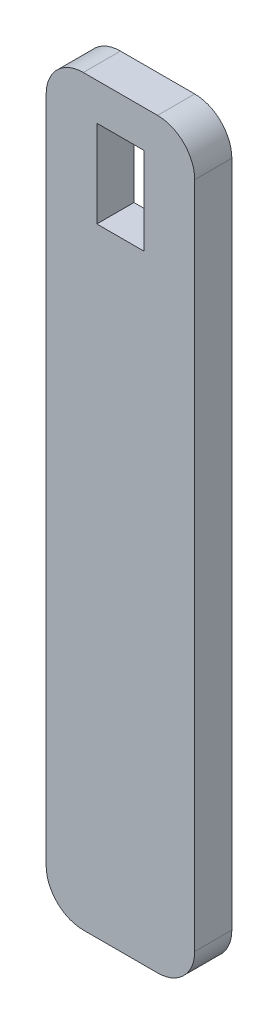
ISO-10303-21;
HEADER;
FILE_DESCRIPTION(('STEP AP214'),'2;1');
FILE_NAME('part.step','',(''),(''),'','','');
FILE_SCHEMA(('AUTOMOTIVE_DESIGN { 1 0 10303 214 1 1 1 1 }'));
ENDSEC;
DATA;
#1=APPLICATION_CONTEXT('core data for automotive mechanical design processes');
#2=APPLICATION_PROTOCOL_DEFINITION('international standard','automotive_design',2000,#1);
#3=PRODUCT_CONTEXT('',#1,'mechanical');
#4=PRODUCT('Part','Part','',(#3));
#5=PRODUCT_RELATED_PRODUCT_CATEGORY('part','',(#4));
#6=PRODUCT_DEFINITION_FORMATION('','',#4);
#7=PRODUCT_DEFINITION_CONTEXT('part definition',#1,'design');
#8=PRODUCT_DEFINITION('design','',#6,#7);
#9=PRODUCT_DEFINITION_SHAPE('','',#8);
#10=(LENGTH_UNIT() NAMED_UNIT(*) SI_UNIT(.MILLI.,.METRE.));
#11=(NAMED_UNIT(*) PLANE_ANGLE_UNIT() SI_UNIT($,.RADIAN.));
#12=(NAMED_UNIT(*) SI_UNIT($,.STERADIAN.) SOLID_ANGLE_UNIT());
#13=UNCERTAINTY_MEASURE_WITH_UNIT(LENGTH_MEASURE(1.E-05),#10,'distance_accuracy_value','');
#14=(GEOMETRIC_REPRESENTATION_CONTEXT(3) GLOBAL_UNCERTAINTY_ASSIGNED_CONTEXT((#13)) GLOBAL_UNIT_ASSIGNED_CONTEXT((#10,
#11,#12)) REPRESENTATION_CONTEXT('',''));
#15=CARTESIAN_POINT('',(0.,0.,0.));
#16=DIRECTION('',(0.,0.,1.));
#17=DIRECTION('',(1.,0.,0.));
#18=AXIS2_PLACEMENT_3D('',#15,#16,#17);
#19=CARTESIAN_POINT('',(0.,0.,10.));
#20=DIRECTION('',(1.,0.,0.));
#21=DIRECTION('',(0.,0.,-1.));
#22=AXIS2_PLACEMENT_3D('',#19,#20,#21);
#23=PLANE('',#22);
#24=DIRECTION('',(0.,-1.,0.));
#25=VECTOR('',#24,1.);
#26=CARTESIAN_POINT('',(0.,0.,0.));
#27=LINE('',#26,#25);
#28=CARTESIAN_POINT('',(0.,190.,0.));
#29=VERTEX_POINT('',#28);
#30=CARTESIAN_POINT('',(0.,10.,0.));
#31=VERTEX_POINT('',#30);
#32=EDGE_CURVE('E156',#29,#31,#27,.T.);
#33=ORIENTED_EDGE('',*,*,#32,.T.);
#34=DIRECTION('',(0.,0.,-1.));
#35=VECTOR('',#34,1.);
#36=CARTESIAN_POINT('',(0.,10.,10.));
#37=LINE('',#36,#35);
#38=CARTESIAN_POINT('',(0.,10.,10.));
#39=VERTEX_POINT('',#38);
#40=EDGE_CURVE('E212',#31,#39,#37,.F.);
#41=ORIENTED_EDGE('',*,*,#40,.T.);
#42=DIRECTION('',(0.,-1.,0.));
#43=VECTOR('',#42,1.);
#44=CARTESIAN_POINT('',(0.,0.,10.));
#45=LINE('',#44,#43);
#46=CARTESIAN_POINT('',(0.,190.,10.));
#47=VERTEX_POINT('',#46);
#48=EDGE_CURVE('E160',#47,#39,#45,.T.);
#49=ORIENTED_EDGE('',*,*,#48,.F.);
#50=DIRECTION('',(0.,0.,-1.));
#51=VECTOR('',#50,1.);
#52=CARTESIAN_POINT('',(0.,190.,10.));
#53=LINE('',#52,#51);
#54=EDGE_CURVE('E209',#47,#29,#53,.T.);
#55=ORIENTED_EDGE('',*,*,#54,.T.);
#56=EDGE_LOOP('',(#33,#41,#49,#55));
#57=FACE_BOUND('',#56,.T.);
#58=ADVANCED_FACE('F34',(#57),#23,.F.);
#59=CARTESIAN_POINT('',(0.,0.,10.));
#60=DIRECTION('',(0.,1.,0.));
#61=DIRECTION('',(0.,0.,1.));
#62=AXIS2_PLACEMENT_3D('',#59,#60,#61);
#63=PLANE('',#62);
#64=DIRECTION('',(1.,0.,0.));
#65=VECTOR('',#64,1.);
#66=CARTESIAN_POINT('',(0.,0.,0.));
#67=LINE('',#66,#65);
#68=CARTESIAN_POINT('',(10.,0.,0.));
#69=VERTEX_POINT('',#68);
#70=CARTESIAN_POINT('',(30.,0.,0.));
#71=VERTEX_POINT('',#70);
#72=EDGE_CURVE('E176',#69,#71,#67,.T.);
#73=ORIENTED_EDGE('',*,*,#72,.T.);
#74=DIRECTION('',(0.,0.,-1.));
#75=VECTOR('',#74,1.);
#76=CARTESIAN_POINT('',(30.,0.,10.));
#77=LINE('',#76,#75);
#78=CARTESIAN_POINT('',(30.,0.,10.));
#79=VERTEX_POINT('',#78);
#80=EDGE_CURVE('E199',#71,#79,#77,.F.);
#81=ORIENTED_EDGE('',*,*,#80,.T.);
#82=DIRECTION('',(1.,0.,0.));
#83=VECTOR('',#82,1.);
#84=CARTESIAN_POINT('',(0.,0.,10.));
#85=LINE('',#84,#83);
#86=CARTESIAN_POINT('',(10.,0.,10.));
#87=VERTEX_POINT('',#86);
#88=EDGE_CURVE('E163',#87,#79,#85,.T.);
#89=ORIENTED_EDGE('',*,*,#88,.F.);
#90=DIRECTION('',(0.,0.,-1.));
#91=VECTOR('',#90,1.);
#92=CARTESIAN_POINT('',(10.,0.,10.));
#93=LINE('',#92,#91);
#94=EDGE_CURVE('E196',#87,#69,#93,.T.);
#95=ORIENTED_EDGE('',*,*,#94,.T.);
#96=EDGE_LOOP('',(#73,#81,#89,#95));
#97=FACE_BOUND('',#96,.T.);
#98=ADVANCED_FACE('F237',(#97),#63,.F.);
#99=CARTESIAN_POINT('',(40.,0.,10.));
#100=DIRECTION('',(-1.,0.,0.));
#101=DIRECTION('',(0.,0.,1.));
#102=AXIS2_PLACEMENT_3D('',#99,#100,#101);
#103=PLANE('',#102);
#104=DIRECTION('',(0.,1.,0.));
#105=VECTOR('',#104,1.);
#106=CARTESIAN_POINT('',(40.,0.,10.));
#107=LINE('',#106,#105);
#108=CARTESIAN_POINT('',(40.,10.,10.));
#109=VERTEX_POINT('',#108);
#110=CARTESIAN_POINT('',(40.,190.,10.));
#111=VERTEX_POINT('',#110);
#112=EDGE_CURVE('E167',#109,#111,#107,.T.);
#113=ORIENTED_EDGE('',*,*,#112,.F.);
#114=DIRECTION('',(0.,0.,-1.));
#115=VECTOR('',#114,1.);
#116=CARTESIAN_POINT('',(40.,10.,10.));
#117=LINE('',#116,#115);
#118=CARTESIAN_POINT('',(40.,10.,0.));
#119=VERTEX_POINT('',#118);
#120=EDGE_CURVE('E185',#109,#119,#117,.T.);
#121=ORIENTED_EDGE('',*,*,#120,.T.);
#122=DIRECTION('',(0.,1.,0.));
#123=VECTOR('',#122,1.);
#124=CARTESIAN_POINT('',(40.,0.,0.));
#125=LINE('',#124,#123);
#126=CARTESIAN_POINT('',(40.,190.,0.));
#127=VERTEX_POINT('',#126);
#128=EDGE_CURVE('E179',#119,#127,#125,.T.);
#129=ORIENTED_EDGE('',*,*,#128,.T.);
#130=DIRECTION('',(0.,0.,-1.));
#131=VECTOR('',#130,1.);
#132=CARTESIAN_POINT('',(40.,190.,10.));
#133=LINE('',#132,#131);
#134=EDGE_CURVE('E173',#127,#111,#133,.F.);
#135=ORIENTED_EDGE('',*,*,#134,.T.);
#136=EDGE_LOOP('',(#113,#121,#129,#135));
#137=FACE_BOUND('',#136,.T.);
#138=ADVANCED_FACE('F245',(#137),#103,.F.);
#139=CARTESIAN_POINT('',(0.,200.,10.));
#140=DIRECTION('',(0.,-1.,0.));
#141=DIRECTION('',(0.,0.,-1.));
#142=AXIS2_PLACEMENT_3D('',#139,#140,#141);
#143=PLANE('',#142);
#144=DIRECTION('',(-1.,0.,0.));
#145=VECTOR('',#144,1.);
#146=CARTESIAN_POINT('',(0.,200.,10.));
#147=LINE('',#146,#145);
#148=CARTESIAN_POINT('',(30.,200.,10.));
#149=VERTEX_POINT('',#148);
#150=CARTESIAN_POINT('',(10.,200.,10.));
#151=VERTEX_POINT('',#150);
#152=EDGE_CURVE('E170',#149,#151,#147,.T.);
#153=ORIENTED_EDGE('',*,*,#152,.F.);
#154=DIRECTION('',(0.,0.,-1.));
#155=VECTOR('',#154,1.);
#156=CARTESIAN_POINT('',(30.,200.,10.));
#157=LINE('',#156,#155);
#158=CARTESIAN_POINT('',(30.,200.,0.));
#159=VERTEX_POINT('',#158);
#160=EDGE_CURVE('E11',#149,#159,#157,.T.);
#161=ORIENTED_EDGE('',*,*,#160,.T.);
#162=DIRECTION('',(-1.,0.,0.));
#163=VECTOR('',#162,1.);
#164=CARTESIAN_POINT('',(0.,200.,0.));
#165=LINE('',#164,#163);
#166=CARTESIAN_POINT('',(10.,200.,0.));
#167=VERTEX_POINT('',#166);
#168=EDGE_CURVE('E164',#159,#167,#165,.T.);
#169=ORIENTED_EDGE('',*,*,#168,.T.);
#170=DIRECTION('',(0.,0.,-1.));
#171=VECTOR('',#170,1.);
#172=CARTESIAN_POINT('',(10.,200.,10.));
#173=LINE('',#172,#171);
#174=EDGE_CURVE('E42',#167,#151,#173,.F.);
#175=ORIENTED_EDGE('',*,*,#174,.T.);
#176=EDGE_LOOP('',(#153,#161,#169,#175));
#177=FACE_BOUND('',#176,.T.);
#178=ADVANCED_FACE('F216',(#177),#143,.F.);
#179=CARTESIAN_POINT('',(0.,0.,10.));
#180=DIRECTION('',(0.,0.,-1.));
#181=DIRECTION('',(-1.,0.,0.));
#182=AXIS2_PLACEMENT_3D('',#179,#180,#181);
#183=PLANE('',#182);
#184=DIRECTION('',(1.,0.,0.));
#185=VECTOR('',#184,1.);
#186=CARTESIAN_POINT('',(13.65,166.5,10.));
#187=LINE('',#186,#185);
#188=CARTESIAN_POINT('',(13.65,166.5,10.));
#189=VERTEX_POINT('',#188);
#190=CARTESIAN_POINT('',(26.35,166.5,10.));
#191=VERTEX_POINT('',#190);
#192=EDGE_CURVE('E150',#189,#191,#187,.T.);
#193=ORIENTED_EDGE('',*,*,#192,.F.);
#194=DIRECTION('',(0.,-1.,0.));
#195=VECTOR('',#194,1.);
#196=CARTESIAN_POINT('',(13.65,190.,10.));
#197=LINE('',#196,#195);
#198=CARTESIAN_POINT('',(13.65,190.,10.));
#199=VERTEX_POINT('',#198);
#200=EDGE_CURVE('E49',#199,#189,#197,.T.);
#201=ORIENTED_EDGE('',*,*,#200,.F.);
#202=DIRECTION('',(-1.,0.,0.));
#203=VECTOR('',#202,1.);
#204=CARTESIAN_POINT('',(13.65,190.,10.));
#205=LINE('',#204,#203);
#206=CARTESIAN_POINT('',(26.35,190.,10.));
#207=VERTEX_POINT('',#206);
#208=EDGE_CURVE('E141',#207,#199,#205,.T.);
#209=ORIENTED_EDGE('',*,*,#208,.F.);
#210=DIRECTION('',(0.,1.,0.));
#211=VECTOR('',#210,1.);
#212=CARTESIAN_POINT('',(26.35,190.,10.));
#213=LINE('',#212,#211);
#214=EDGE_CURVE('E144',#191,#207,#213,.T.);
#215=ORIENTED_EDGE('',*,*,#214,.F.);
#216=EDGE_LOOP('',(#193,#201,#209,#215));
#217=FACE_BOUND('',#216,.T.);
#218=ORIENTED_EDGE('',*,*,#88,.T.);
#219=CARTESIAN_POINT('',(30.,10.,10.));
#220=DIRECTION('',(0.,0.,-1.));
#221=DIRECTION('',(-1.,0.,0.));
#222=AXIS2_PLACEMENT_3D('',#219,#220,#221);
#223=CIRCLE('',#222,10.);
#224=EDGE_CURVE('E207',#79,#109,#223,.F.);
#225=ORIENTED_EDGE('',*,*,#224,.T.);
#226=ORIENTED_EDGE('',*,*,#112,.T.);
#227=CARTESIAN_POINT('',(30.,190.,10.));
#228=DIRECTION('',(0.,0.,-1.));
#229=DIRECTION('',(-1.,0.,0.));
#230=AXIS2_PLACEMENT_3D('',#227,#228,#229);
#231=CIRCLE('',#230,10.);
#232=EDGE_CURVE('E203',#111,#149,#231,.F.);
#233=ORIENTED_EDGE('',*,*,#232,.T.);
#234=ORIENTED_EDGE('',*,*,#152,.T.);
#235=CARTESIAN_POINT('',(10.,190.,10.));
#236=DIRECTION('',(0.,0.,-1.));
#237=DIRECTION('',(-1.,0.,0.));
#238=AXIS2_PLACEMENT_3D('',#235,#236,#237);
#239=CIRCLE('',#238,10.);
#240=EDGE_CURVE('E201',#151,#47,#239,.F.);
#241=ORIENTED_EDGE('',*,*,#240,.T.);
#242=ORIENTED_EDGE('',*,*,#48,.T.);
#243=CARTESIAN_POINT('',(10.,10.,10.));
#244=DIRECTION('',(0.,0.,-1.));
#245=DIRECTION('',(-1.,0.,0.));
#246=AXIS2_PLACEMENT_3D('',#243,#244,#245);
#247=CIRCLE('',#246,10.);
#248=EDGE_CURVE('E205',#39,#87,#247,.F.);
#249=ORIENTED_EDGE('',*,*,#248,.T.);
#250=EDGE_LOOP('',(#218,#225,#226,#233,#234,#241,#242,#249));
#251=FACE_BOUND('',#250,.T.);
#252=ADVANCED_FACE('F222',(#217,#251),#183,.F.);
#253=CARTESIAN_POINT('',(0.,0.,0.));
#254=DIRECTION('',(0.,0.,-1.));
#255=DIRECTION('',(-1.,0.,0.));
#256=AXIS2_PLACEMENT_3D('',#253,#254,#255);
#257=PLANE('',#256);
#258=DIRECTION('',(0.,-1.,0.));
#259=VECTOR('',#258,1.);
#260=CARTESIAN_POINT('',(13.65,190.,0.));
#261=LINE('',#260,#259);
#262=CARTESIAN_POINT('',(13.65,190.,0.));
#263=VERTEX_POINT('',#262);
#264=CARTESIAN_POINT('',(13.65,166.5,0.));
#265=VERTEX_POINT('',#264);
#266=EDGE_CURVE('E125',#263,#265,#261,.T.);
#267=ORIENTED_EDGE('',*,*,#266,.T.);
#268=DIRECTION('',(1.,0.,0.));
#269=VECTOR('',#268,1.);
#270=CARTESIAN_POINT('',(13.65,166.5,0.));
#271=LINE('',#270,#269);
#272=CARTESIAN_POINT('',(26.35,166.5,0.));
#273=VERTEX_POINT('',#272);
#274=EDGE_CURVE('E134',#265,#273,#271,.T.);
#275=ORIENTED_EDGE('',*,*,#274,.T.);
#276=DIRECTION('',(0.,1.,0.));
#277=VECTOR('',#276,1.);
#278=CARTESIAN_POINT('',(26.35,190.,0.));
#279=LINE('',#278,#277);
#280=CARTESIAN_POINT('',(26.35,190.,0.));
#281=VERTEX_POINT('',#280);
#282=EDGE_CURVE('E57',#273,#281,#279,.T.);
#283=ORIENTED_EDGE('',*,*,#282,.T.);
#284=DIRECTION('',(-1.,0.,0.));
#285=VECTOR('',#284,1.);
#286=CARTESIAN_POINT('',(13.65,190.,0.));
#287=LINE('',#286,#285);
#288=EDGE_CURVE('E131',#281,#263,#287,.T.);
#289=ORIENTED_EDGE('',*,*,#288,.T.);
#290=EDGE_LOOP('',(#267,#275,#283,#289));
#291=FACE_BOUND('',#290,.T.);
#292=ORIENTED_EDGE('',*,*,#128,.F.);
#293=CARTESIAN_POINT('',(30.,10.,0.));
#294=DIRECTION('',(0.,0.,-1.));
#295=DIRECTION('',(-1.,0.,0.));
#296=AXIS2_PLACEMENT_3D('',#293,#294,#295);
#297=CIRCLE('',#296,10.);
#298=EDGE_CURVE('E194',#119,#71,#297,.T.);
#299=ORIENTED_EDGE('',*,*,#298,.T.);
#300=ORIENTED_EDGE('',*,*,#72,.F.);
#301=CARTESIAN_POINT('',(10.,10.,0.));
#302=DIRECTION('',(0.,0.,-1.));
#303=DIRECTION('',(-1.,0.,0.));
#304=AXIS2_PLACEMENT_3D('',#301,#302,#303);
#305=CIRCLE('',#304,10.);
#306=EDGE_CURVE('E192',#69,#31,#305,.T.);
#307=ORIENTED_EDGE('',*,*,#306,.T.);
#308=ORIENTED_EDGE('',*,*,#32,.F.);
#309=CARTESIAN_POINT('',(10.,190.,0.));
#310=DIRECTION('',(0.,0.,-1.));
#311=DIRECTION('',(-1.,0.,0.));
#312=AXIS2_PLACEMENT_3D('',#309,#310,#311);
#313=CIRCLE('',#312,10.);
#314=EDGE_CURVE('E188',#29,#167,#313,.T.);
#315=ORIENTED_EDGE('',*,*,#314,.T.);
#316=ORIENTED_EDGE('',*,*,#168,.F.);
#317=CARTESIAN_POINT('',(30.,190.,0.));
#318=DIRECTION('',(0.,0.,-1.));
#319=DIRECTION('',(-1.,0.,0.));
#320=AXIS2_PLACEMENT_3D('',#317,#318,#319);
#321=CIRCLE('',#320,10.);
#322=EDGE_CURVE('E190',#159,#127,#321,.T.);
#323=ORIENTED_EDGE('',*,*,#322,.T.);
#324=EDGE_LOOP('',(#292,#299,#300,#307,#308,#315,#316,#323));
#325=FACE_BOUND('',#324,.T.);
#326=ADVANCED_FACE('F138',(#291,#325),#257,.T.);
#327=CARTESIAN_POINT('',(30.,10.,10.));
#328=DIRECTION('',(0.,0.,-1.));
#329=DIRECTION('',(-1.,0.,0.));
#330=AXIS2_PLACEMENT_3D('',#327,#328,#329);
#331=CYLINDRICAL_SURFACE('',#330,10.);
#332=ORIENTED_EDGE('',*,*,#224,.F.);
#333=ORIENTED_EDGE('',*,*,#80,.F.);
#334=ORIENTED_EDGE('',*,*,#298,.F.);
#335=ORIENTED_EDGE('',*,*,#120,.F.);
#336=EDGE_LOOP('',(#332,#333,#334,#335));
#337=FACE_BOUND('',#336,.T.);
#338=ADVANCED_FACE('F243',(#337),#331,.T.);
#339=CARTESIAN_POINT('',(10.,10.,10.));
#340=DIRECTION('',(0.,0.,-1.));
#341=DIRECTION('',(-1.,0.,0.));
#342=AXIS2_PLACEMENT_3D('',#339,#340,#341);
#343=CYLINDRICAL_SURFACE('',#342,10.);
#344=ORIENTED_EDGE('',*,*,#248,.F.);
#345=ORIENTED_EDGE('',*,*,#40,.F.);
#346=ORIENTED_EDGE('',*,*,#306,.F.);
#347=ORIENTED_EDGE('',*,*,#94,.F.);
#348=EDGE_LOOP('',(#344,#345,#346,#347));
#349=FACE_BOUND('',#348,.T.);
#350=ADVANCED_FACE('F234',(#349),#343,.T.);
#351=CARTESIAN_POINT('',(30.,190.,10.));
#352=DIRECTION('',(0.,0.,-1.));
#353=DIRECTION('',(-1.,0.,0.));
#354=AXIS2_PLACEMENT_3D('',#351,#352,#353);
#355=CYLINDRICAL_SURFACE('',#354,10.);
#356=ORIENTED_EDGE('',*,*,#232,.F.);
#357=ORIENTED_EDGE('',*,*,#134,.F.);
#358=ORIENTED_EDGE('',*,*,#322,.F.);
#359=ORIENTED_EDGE('',*,*,#160,.F.);
#360=EDGE_LOOP('',(#356,#357,#358,#359));
#361=FACE_BOUND('',#360,.T.);
#362=ADVANCED_FACE('F248',(#361),#355,.T.);
#363=CARTESIAN_POINT('',(10.,190.,10.));
#364=DIRECTION('',(0.,0.,-1.));
#365=DIRECTION('',(-1.,0.,0.));
#366=AXIS2_PLACEMENT_3D('',#363,#364,#365);
#367=CYLINDRICAL_SURFACE('',#366,10.);
#368=ORIENTED_EDGE('',*,*,#240,.F.);
#369=ORIENTED_EDGE('',*,*,#174,.F.);
#370=ORIENTED_EDGE('',*,*,#314,.F.);
#371=ORIENTED_EDGE('',*,*,#54,.F.);
#372=EDGE_LOOP('',(#368,#369,#370,#371));
#373=FACE_BOUND('',#372,.T.);
#374=ADVANCED_FACE('F36',(#373),#367,.T.);
#375=CARTESIAN_POINT('',(13.65,190.,0.));
#376=DIRECTION('',(-1.,0.,0.));
#377=DIRECTION('',(0.,-1.,0.));
#378=AXIS2_PLACEMENT_3D('',#375,#376,#377);
#379=PLANE('',#378);
#380=ORIENTED_EDGE('',*,*,#200,.T.);
#381=DIRECTION('',(0.,0.,1.));
#382=VECTOR('',#381,1.);
#383=CARTESIAN_POINT('',(13.65,166.5,0.));
#384=LINE('',#383,#382);
#385=EDGE_CURVE('E121',#265,#189,#384,.T.);
#386=ORIENTED_EDGE('',*,*,#385,.F.);
#387=ORIENTED_EDGE('',*,*,#266,.F.);
#388=DIRECTION('',(0.,0.,1.));
#389=VECTOR('',#388,1.);
#390=CARTESIAN_POINT('',(13.65,190.,0.));
#391=LINE('',#390,#389);
#392=EDGE_CURVE('E154',#263,#199,#391,.T.);
#393=ORIENTED_EDGE('',*,*,#392,.T.);
#394=EDGE_LOOP('',(#380,#386,#387,#393));
#395=FACE_BOUND('',#394,.T.);
#396=ADVANCED_FACE('F123',(#395),#379,.F.);
#397=CARTESIAN_POINT('',(13.65,190.,0.));
#398=DIRECTION('',(0.,1.,0.));
#399=DIRECTION('',(0.,0.,1.));
#400=AXIS2_PLACEMENT_3D('',#397,#398,#399);
#401=PLANE('',#400);
#402=ORIENTED_EDGE('',*,*,#208,.T.);
#403=ORIENTED_EDGE('',*,*,#392,.F.);
#404=ORIENTED_EDGE('',*,*,#288,.F.);
#405=DIRECTION('',(0.,0.,1.));
#406=VECTOR('',#405,1.);
#407=CARTESIAN_POINT('',(26.35,190.,0.));
#408=LINE('',#407,#406);
#409=EDGE_CURVE('E157',#281,#207,#408,.T.);
#410=ORIENTED_EDGE('',*,*,#409,.T.);
#411=EDGE_LOOP('',(#402,#403,#404,#410));
#412=FACE_BOUND('',#411,.T.);
#413=ADVANCED_FACE('F302',(#412),#401,.F.);
#414=CARTESIAN_POINT('',(26.35,190.,0.));
#415=DIRECTION('',(1.,0.,0.));
#416=DIRECTION('',(0.,1.,0.));
#417=AXIS2_PLACEMENT_3D('',#414,#415,#416);
#418=PLANE('',#417);
#419=ORIENTED_EDGE('',*,*,#214,.T.);
#420=ORIENTED_EDGE('',*,*,#409,.F.);
#421=ORIENTED_EDGE('',*,*,#282,.F.);
#422=DIRECTION('',(0.,0.,1.));
#423=VECTOR('',#422,1.);
#424=CARTESIAN_POINT('',(26.35,166.5,0.));
#425=LINE('',#424,#423);
#426=EDGE_CURVE('E130',#273,#191,#425,.T.);
#427=ORIENTED_EDGE('',*,*,#426,.T.);
#428=EDGE_LOOP('',(#419,#420,#421,#427));
#429=FACE_BOUND('',#428,.T.);
#430=ADVANCED_FACE('F311',(#429),#418,.F.);
#431=CARTESIAN_POINT('',(13.65,166.5,0.));
#432=DIRECTION('',(0.,-1.,0.));
#433=DIRECTION('',(0.,0.,-1.));
#434=AXIS2_PLACEMENT_3D('',#431,#432,#433);
#435=PLANE('',#434);
#436=ORIENTED_EDGE('',*,*,#192,.T.);
#437=ORIENTED_EDGE('',*,*,#426,.F.);
#438=ORIENTED_EDGE('',*,*,#274,.F.);
#439=ORIENTED_EDGE('',*,*,#385,.T.);
#440=EDGE_LOOP('',(#436,#437,#438,#439));
#441=FACE_BOUND('',#440,.T.);
#442=ADVANCED_FACE('F135',(#441),#435,.F.);
#443=CLOSED_SHELL('',(#58,#98,#138,#178,#252,#326,#338,#350,#362,#374,#396,#413,#430,#442));
#444=MANIFOLD_SOLID_BREP('B2',#443);
#445=ADVANCED_BREP_SHAPE_REPRESENTATION('',(#18,#444),#14);
#446=SHAPE_DEFINITION_REPRESENTATION(#9,#445);
ENDSEC;
END-ISO-10303-21;
